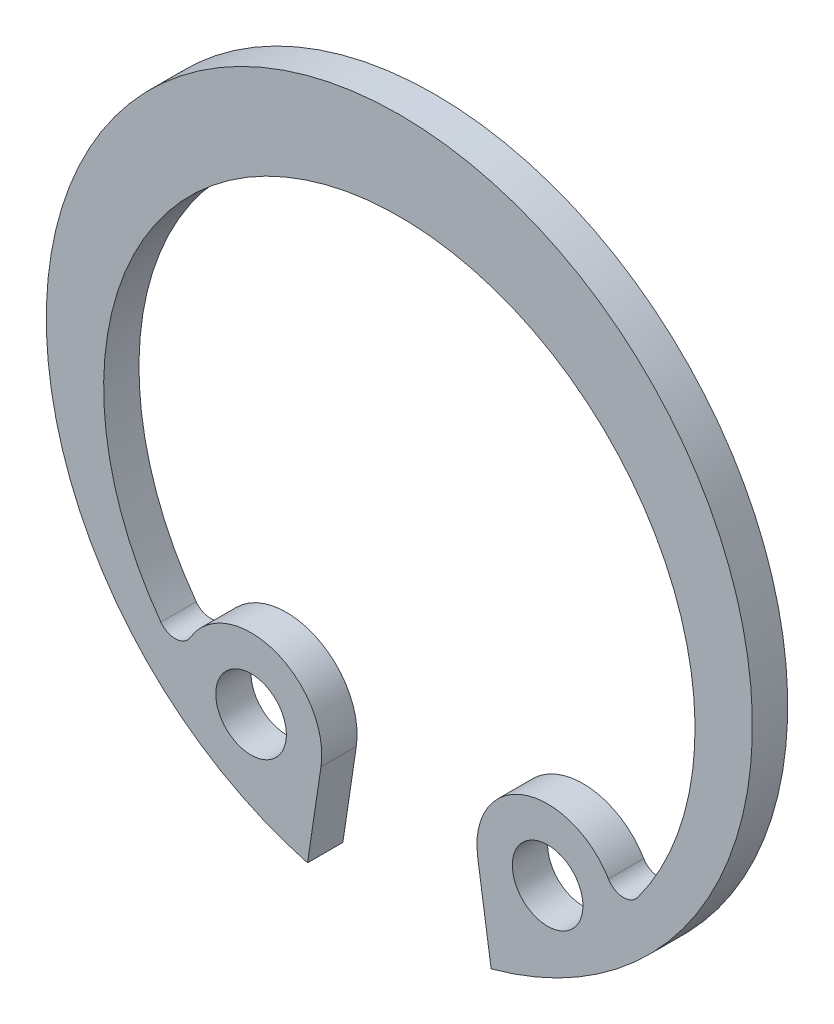
ISO-10303-21;
HEADER;
FILE_DESCRIPTION(('STEP AP214'),'2;1');
FILE_NAME('part.step','',(''),(''),'','','');
FILE_SCHEMA(('AUTOMOTIVE_DESIGN { 1 0 10303 214 1 1 1 1 }'));
ENDSEC;
DATA;
#1=APPLICATION_CONTEXT('core data for automotive mechanical design processes');
#2=APPLICATION_PROTOCOL_DEFINITION('international standard','automotive_design',2000,#1);
#3=PRODUCT_CONTEXT('',#1,'mechanical');
#4=PRODUCT('Part','Part','',(#3));
#5=PRODUCT_RELATED_PRODUCT_CATEGORY('part','',(#4));
#6=PRODUCT_DEFINITION_FORMATION('','',#4);
#7=PRODUCT_DEFINITION_CONTEXT('part definition',#1,'design');
#8=PRODUCT_DEFINITION('design','',#6,#7);
#9=PRODUCT_DEFINITION_SHAPE('','',#8);
#10=(LENGTH_UNIT() NAMED_UNIT(*) SI_UNIT(.MILLI.,.METRE.));
#11=(NAMED_UNIT(*) PLANE_ANGLE_UNIT() SI_UNIT($,.RADIAN.));
#12=(NAMED_UNIT(*) SI_UNIT($,.STERADIAN.) SOLID_ANGLE_UNIT());
#13=UNCERTAINTY_MEASURE_WITH_UNIT(LENGTH_MEASURE(1.E-05),#10,'distance_accuracy_value','');
#14=(GEOMETRIC_REPRESENTATION_CONTEXT(3) GLOBAL_UNCERTAINTY_ASSIGNED_CONTEXT((#13)) GLOBAL_UNIT_ASSIGNED_CONTEXT((#10,
#11,#12)) REPRESENTATION_CONTEXT('',''));
#15=CARTESIAN_POINT('',(0.,0.,0.));
#16=DIRECTION('',(0.,0.,1.));
#17=DIRECTION('',(1.,0.,0.));
#18=AXIS2_PLACEMENT_3D('',#15,#16,#17);
#19=CARTESIAN_POINT('',(-4.2,-6.81209963829693,1.));
#20=DIRECTION('',(0.,0.,1.));
#21=DIRECTION('',(1.,0.,0.));
#22=AXIS2_PLACEMENT_3D('',#19,#20,#21);
#23=PLANE('',#22);
#24=CARTESIAN_POINT('',(-4.2,-6.81209963829693,1.));
#25=DIRECTION('',(0.,0.,1.));
#26=DIRECTION('',(1.,0.,0.));
#27=AXIS2_PLACEMENT_3D('',#24,#25,#26);
#28=CIRCLE('',#27,1.);
#29=CARTESIAN_POINT('',(-3.2,-6.81209963829693,1.));
#30=VERTEX_POINT('',#29);
#31=EDGE_CURVE('E135',#30,#30,#28,.T.);
#32=ORIENTED_EDGE('',*,*,#31,.F.);
#33=EDGE_LOOP('',(#32));
#34=FACE_BOUND('',#33,.T.);
#35=CARTESIAN_POINT('',(-4.2,-6.81209963829693,1.));
#36=DIRECTION('',(0.,0.,1.));
#37=DIRECTION('',(1.,0.,0.));
#38=AXIS2_PLACEMENT_3D('',#35,#36,#37);
#39=CIRCLE('',#38,2.00279335495333);
#40=CARTESIAN_POINT('',(-2.21920560091532,-7.10813134470688,1.));
#41=VERTEX_POINT('',#40);
#42=CARTESIAN_POINT('',(-5.920924077702,-5.78759900802346,1.));
#43=VERTEX_POINT('',#42);
#44=EDGE_CURVE('E146',#41,#43,#39,.T.);
#45=ORIENTED_EDGE('',*,*,#44,.T.);
#46=CARTESIAN_POINT('',(-6.35055504123745,-5.53183107576533,1.));
#47=DIRECTION('',(0.,0.,-1.));
#48=DIRECTION('',(1.,0.,0.));
#49=AXIS2_PLACEMENT_3D('',#46,#47,#48);
#50=CIRCLE('',#49,0.499999999999999);
#51=CARTESIAN_POINT('',(-6.75376488512554,-5.82750289009963,1.));
#52=VERTEX_POINT('',#51);
#53=EDGE_CURVE('E94',#43,#52,#50,.T.);
#54=ORIENTED_EDGE('',*,*,#53,.T.);
#55=CARTESIAN_POINT('',(0.,-0.875000000000001,1.));
#56=DIRECTION('',(0.,0.,-1.));
#57=DIRECTION('',(1.,0.,0.));
#58=AXIS2_PLACEMENT_3D('',#55,#56,#57);
#59=CIRCLE('',#58,8.375);
#60=CARTESIAN_POINT('',(6.75376488512554,-5.82750289009963,1.));
#61=VERTEX_POINT('',#60);
#62=EDGE_CURVE('E161',#52,#61,#59,.T.);
#63=ORIENTED_EDGE('',*,*,#62,.T.);
#64=CARTESIAN_POINT('',(6.35055504123745,-5.53183107576533,1.));
#65=DIRECTION('',(0.,0.,-1.));
#66=DIRECTION('',(-1.,0.,0.));
#67=AXIS2_PLACEMENT_3D('',#64,#65,#66);
#68=CIRCLE('',#67,0.499999999999999);
#69=CARTESIAN_POINT('',(5.920924077702,-5.78759900802346,1.));
#70=VERTEX_POINT('',#69);
#71=EDGE_CURVE('E174',#61,#70,#68,.T.);
#72=ORIENTED_EDGE('',*,*,#71,.T.);
#73=CARTESIAN_POINT('',(4.2,-6.81209963829693,1.));
#74=DIRECTION('',(0.,0.,1.));
#75=DIRECTION('',(1.,0.,0.));
#76=AXIS2_PLACEMENT_3D('',#73,#74,#75);
#77=CIRCLE('',#76,2.00279335495333);
#78=CARTESIAN_POINT('',(2.21920560091532,-7.10813134470688,1.));
#79=VERTEX_POINT('',#78);
#80=EDGE_CURVE('E113',#70,#79,#77,.T.);
#81=ORIENTED_EDGE('',*,*,#80,.T.);
#82=DIRECTION('',(0.147809411129611,-0.989015863361917,0.));
#83=VECTOR('',#82,1.);
#84=CARTESIAN_POINT('',(2.21920560091532,-7.10813134470688,1.));
#85=LINE('',#84,#83);
#86=CARTESIAN_POINT('',(2.6,-9.65608616365865,1.));
#87=VERTEX_POINT('',#86);
#88=EDGE_CURVE('E107',#79,#87,#85,.T.);
#89=ORIENTED_EDGE('',*,*,#88,.T.);
#90=CARTESIAN_POINT('',(0.,0.,1.));
#91=DIRECTION('',(0.,0.,1.));
#92=DIRECTION('',(1.,0.,0.));
#93=AXIS2_PLACEMENT_3D('',#90,#91,#92);
#94=CIRCLE('',#93,10.);
#95=CARTESIAN_POINT('',(-2.6,-9.65608616365865,1.));
#96=VERTEX_POINT('',#95);
#97=EDGE_CURVE('E111',#87,#96,#94,.T.);
#98=ORIENTED_EDGE('',*,*,#97,.T.);
#99=DIRECTION('',(0.147809411129611,0.989015863361917,0.));
#100=VECTOR('',#99,1.);
#101=CARTESIAN_POINT('',(-2.21920560091532,-7.10813134470688,1.));
#102=LINE('',#101,#100);
#103=EDGE_CURVE('E51',#96,#41,#102,.T.);
#104=ORIENTED_EDGE('',*,*,#103,.T.);
#105=EDGE_LOOP('',(#45,#54,#63,#72,#81,#89,#98,#104));
#106=FACE_BOUND('',#105,.T.);
#107=CARTESIAN_POINT('',(4.2,-6.81209963829693,1.));
#108=DIRECTION('',(0.,0.,1.));
#109=DIRECTION('',(1.,0.,0.));
#110=AXIS2_PLACEMENT_3D('',#107,#108,#109);
#111=CIRCLE('',#110,1.);
#112=CARTESIAN_POINT('',(5.2,-6.81209963829693,1.));
#113=VERTEX_POINT('',#112);
#114=EDGE_CURVE('E183',#113,#113,#111,.T.);
#115=ORIENTED_EDGE('',*,*,#114,.F.);
#116=EDGE_LOOP('',(#115));
#117=FACE_BOUND('',#116,.T.);
#118=ADVANCED_FACE('F34',(#34,#106,#117),#23,.T.);
#119=CARTESIAN_POINT('',(-4.2,-6.81209963829693,0.));
#120=DIRECTION('',(0.,0.,1.));
#121=DIRECTION('',(1.,0.,0.));
#122=AXIS2_PLACEMENT_3D('',#119,#120,#121);
#123=PLANE('',#122);
#124=CARTESIAN_POINT('',(-4.2,-6.81209963829693,0.));
#125=DIRECTION('',(0.,0.,1.));
#126=DIRECTION('',(1.,0.,0.));
#127=AXIS2_PLACEMENT_3D('',#124,#125,#126);
#128=CIRCLE('',#127,1.);
#129=CARTESIAN_POINT('',(-3.2,-6.81209963829693,0.));
#130=VERTEX_POINT('',#129);
#131=EDGE_CURVE('E180',#130,#130,#128,.T.);
#132=ORIENTED_EDGE('',*,*,#131,.T.);
#133=EDGE_LOOP('',(#132));
#134=FACE_BOUND('',#133,.T.);
#135=CARTESIAN_POINT('',(-4.2,-6.81209963829693,0.));
#136=DIRECTION('',(0.,0.,1.));
#137=DIRECTION('',(1.,0.,0.));
#138=AXIS2_PLACEMENT_3D('',#135,#136,#137);
#139=CIRCLE('',#138,2.00279335495333);
#140=CARTESIAN_POINT('',(-2.21920560091532,-7.10813134470688,0.));
#141=VERTEX_POINT('',#140);
#142=CARTESIAN_POINT('',(-5.920924077702,-5.78759900802346,0.));
#143=VERTEX_POINT('',#142);
#144=EDGE_CURVE('E131',#141,#143,#139,.T.);
#145=ORIENTED_EDGE('',*,*,#144,.F.);
#146=DIRECTION('',(0.147809411129611,0.989015863361917,0.));
#147=VECTOR('',#146,1.);
#148=CARTESIAN_POINT('',(-2.21920560091532,-7.10813134470688,0.));
#149=LINE('',#148,#147);
#150=CARTESIAN_POINT('',(-2.6,-9.65608616365865,0.));
#151=VERTEX_POINT('',#150);
#152=EDGE_CURVE('E86',#151,#141,#149,.T.);
#153=ORIENTED_EDGE('',*,*,#152,.F.);
#154=CARTESIAN_POINT('',(0.,0.,0.));
#155=DIRECTION('',(0.,0.,1.));
#156=DIRECTION('',(1.,0.,0.));
#157=AXIS2_PLACEMENT_3D('',#154,#155,#156);
#158=CIRCLE('',#157,10.);
#159=CARTESIAN_POINT('',(2.6,-9.65608616365865,0.));
#160=VERTEX_POINT('',#159);
#161=EDGE_CURVE('E80',#160,#151,#158,.T.);
#162=ORIENTED_EDGE('',*,*,#161,.F.);
#163=DIRECTION('',(0.147809411129611,-0.989015863361917,0.));
#164=VECTOR('',#163,1.);
#165=CARTESIAN_POINT('',(2.21920560091532,-7.10813134470688,0.));
#166=LINE('',#165,#164);
#167=CARTESIAN_POINT('',(2.21920560091532,-7.10813134470688,0.));
#168=VERTEX_POINT('',#167);
#169=EDGE_CURVE('E121',#168,#160,#166,.T.);
#170=ORIENTED_EDGE('',*,*,#169,.F.);
#171=CARTESIAN_POINT('',(4.2,-6.81209963829693,0.));
#172=DIRECTION('',(0.,0.,1.));
#173=DIRECTION('',(1.,0.,0.));
#174=AXIS2_PLACEMENT_3D('',#171,#172,#173);
#175=CIRCLE('',#174,2.00279335495333);
#176=CARTESIAN_POINT('',(5.920924077702,-5.78759900802346,0.));
#177=VERTEX_POINT('',#176);
#178=EDGE_CURVE('E141',#177,#168,#175,.T.);
#179=ORIENTED_EDGE('',*,*,#178,.F.);
#180=CARTESIAN_POINT('',(6.35055504123745,-5.53183107576533,0.));
#181=DIRECTION('',(0.,0.,-1.));
#182=DIRECTION('',(-1.,0.,0.));
#183=AXIS2_PLACEMENT_3D('',#180,#181,#182);
#184=CIRCLE('',#183,0.499999999999999);
#185=CARTESIAN_POINT('',(6.75376488512554,-5.82750289009963,0.));
#186=VERTEX_POINT('',#185);
#187=EDGE_CURVE('E139',#186,#177,#184,.T.);
#188=ORIENTED_EDGE('',*,*,#187,.F.);
#189=CARTESIAN_POINT('',(0.,-0.875000000000001,0.));
#190=DIRECTION('',(0.,0.,-1.));
#191=DIRECTION('',(1.,0.,0.));
#192=AXIS2_PLACEMENT_3D('',#189,#190,#191);
#193=CIRCLE('',#192,8.375);
#194=CARTESIAN_POINT('',(-6.75376488512554,-5.82750289009963,0.));
#195=VERTEX_POINT('',#194);
#196=EDGE_CURVE('E137',#195,#186,#193,.T.);
#197=ORIENTED_EDGE('',*,*,#196,.F.);
#198=CARTESIAN_POINT('',(-6.35055504123745,-5.53183107576533,0.));
#199=DIRECTION('',(0.,0.,-1.));
#200=DIRECTION('',(1.,0.,0.));
#201=AXIS2_PLACEMENT_3D('',#198,#199,#200);
#202=CIRCLE('',#201,0.499999999999999);
#203=EDGE_CURVE('E134',#143,#195,#202,.T.);
#204=ORIENTED_EDGE('',*,*,#203,.F.);
#205=EDGE_LOOP('',(#145,#153,#162,#170,#179,#188,#197,#204));
#206=FACE_BOUND('',#205,.T.);
#207=CARTESIAN_POINT('',(4.2,-6.81209963829693,0.));
#208=DIRECTION('',(0.,0.,1.));
#209=DIRECTION('',(1.,0.,0.));
#210=AXIS2_PLACEMENT_3D('',#207,#208,#209);
#211=CIRCLE('',#210,1.);
#212=CARTESIAN_POINT('',(5.2,-6.81209963829693,0.));
#213=VERTEX_POINT('',#212);
#214=EDGE_CURVE('E186',#213,#213,#211,.T.);
#215=ORIENTED_EDGE('',*,*,#214,.T.);
#216=EDGE_LOOP('',(#215));
#217=FACE_BOUND('',#216,.T.);
#218=ADVANCED_FACE('F165',(#134,#206,#217),#123,.F.);
#219=CARTESIAN_POINT('',(-4.2,-6.81209963829693,1.));
#220=DIRECTION('',(0.,0.,-1.));
#221=DIRECTION('',(-1.,0.,0.));
#222=AXIS2_PLACEMENT_3D('',#219,#220,#221);
#223=CYLINDRICAL_SURFACE('',#222,2.00279335495333);
#224=ORIENTED_EDGE('',*,*,#144,.T.);
#225=DIRECTION('',(0.,0.,-1.));
#226=VECTOR('',#225,1.);
#227=CARTESIAN_POINT('',(-5.920924077702,-5.78759900802346,1.));
#228=LINE('',#227,#226);
#229=EDGE_CURVE('E11',#43,#143,#228,.T.);
#230=ORIENTED_EDGE('',*,*,#229,.F.);
#231=ORIENTED_EDGE('',*,*,#44,.F.);
#232=DIRECTION('',(0.,0.,-1.));
#233=VECTOR('',#232,1.);
#234=CARTESIAN_POINT('',(-2.21920560091532,-7.10813134470688,1.));
#235=LINE('',#234,#233);
#236=EDGE_CURVE('E127',#41,#141,#235,.T.);
#237=ORIENTED_EDGE('',*,*,#236,.T.);
#238=EDGE_LOOP('',(#224,#230,#231,#237));
#239=FACE_BOUND('',#238,.T.);
#240=ADVANCED_FACE('F36',(#239),#223,.T.);
#241=CARTESIAN_POINT('',(-6.35055504123745,-5.53183107576533,1.));
#242=DIRECTION('',(0.,0.,-1.));
#243=DIRECTION('',(-1.,0.,0.));
#244=AXIS2_PLACEMENT_3D('',#241,#242,#243);
#245=CYLINDRICAL_SURFACE('',#244,0.499999999999999);
#246=ORIENTED_EDGE('',*,*,#203,.T.);
#247=DIRECTION('',(0.,0.,-1.));
#248=VECTOR('',#247,1.);
#249=CARTESIAN_POINT('',(-6.75376488512554,-5.82750289009963,1.));
#250=LINE('',#249,#248);
#251=EDGE_CURVE('E43',#52,#195,#250,.T.);
#252=ORIENTED_EDGE('',*,*,#251,.F.);
#253=ORIENTED_EDGE('',*,*,#53,.F.);
#254=ORIENTED_EDGE('',*,*,#229,.T.);
#255=EDGE_LOOP('',(#246,#252,#253,#254));
#256=FACE_BOUND('',#255,.T.);
#257=ADVANCED_FACE('F219',(#256),#245,.F.);
#258=CARTESIAN_POINT('',(0.,-0.875000000000001,1.));
#259=DIRECTION('',(0.,0.,-1.));
#260=DIRECTION('',(-1.,0.,0.));
#261=AXIS2_PLACEMENT_3D('',#258,#259,#260);
#262=CYLINDRICAL_SURFACE('',#261,8.375);
#263=ORIENTED_EDGE('',*,*,#196,.T.);
#264=DIRECTION('',(0.,0.,-1.));
#265=VECTOR('',#264,1.);
#266=CARTESIAN_POINT('',(6.75376488512554,-5.82750289009963,1.));
#267=LINE('',#266,#265);
#268=EDGE_CURVE('E153',#61,#186,#267,.T.);
#269=ORIENTED_EDGE('',*,*,#268,.F.);
#270=ORIENTED_EDGE('',*,*,#62,.F.);
#271=ORIENTED_EDGE('',*,*,#251,.T.);
#272=EDGE_LOOP('',(#263,#269,#270,#271));
#273=FACE_BOUND('',#272,.T.);
#274=ADVANCED_FACE('F159',(#273),#262,.F.);
#275=CARTESIAN_POINT('',(6.35055504123745,-5.53183107576533,1.));
#276=DIRECTION('',(0.,0.,-1.));
#277=DIRECTION('',(-1.,0.,0.));
#278=AXIS2_PLACEMENT_3D('',#275,#276,#277);
#279=CYLINDRICAL_SURFACE('',#278,0.499999999999999);
#280=ORIENTED_EDGE('',*,*,#187,.T.);
#281=DIRECTION('',(0.,0.,-1.));
#282=VECTOR('',#281,1.);
#283=CARTESIAN_POINT('',(5.920924077702,-5.78759900802346,1.));
#284=LINE('',#283,#282);
#285=EDGE_CURVE('E150',#70,#177,#284,.T.);
#286=ORIENTED_EDGE('',*,*,#285,.F.);
#287=ORIENTED_EDGE('',*,*,#71,.F.);
#288=ORIENTED_EDGE('',*,*,#268,.T.);
#289=EDGE_LOOP('',(#280,#286,#287,#288));
#290=FACE_BOUND('',#289,.T.);
#291=ADVANCED_FACE('F170',(#290),#279,.F.);
#292=CARTESIAN_POINT('',(4.2,-6.81209963829693,1.));
#293=DIRECTION('',(0.,0.,-1.));
#294=DIRECTION('',(-1.,0.,0.));
#295=AXIS2_PLACEMENT_3D('',#292,#293,#294);
#296=CYLINDRICAL_SURFACE('',#295,2.00279335495333);
#297=ORIENTED_EDGE('',*,*,#178,.T.);
#298=DIRECTION('',(0.,0.,-1.));
#299=VECTOR('',#298,1.);
#300=CARTESIAN_POINT('',(2.21920560091532,-7.10813134470688,1.));
#301=LINE('',#300,#299);
#302=EDGE_CURVE('E122',#79,#168,#301,.T.);
#303=ORIENTED_EDGE('',*,*,#302,.F.);
#304=ORIENTED_EDGE('',*,*,#80,.F.);
#305=ORIENTED_EDGE('',*,*,#285,.T.);
#306=EDGE_LOOP('',(#297,#303,#304,#305));
#307=FACE_BOUND('',#306,.T.);
#308=ADVANCED_FACE('F173',(#307),#296,.T.);
#309=CARTESIAN_POINT('',(2.21920560091532,-7.10813134470688,1.));
#310=DIRECTION('',(0.989015863361917,0.147809411129611,0.));
#311=DIRECTION('',(-0.147809411129611,0.989015863361917,0.));
#312=AXIS2_PLACEMENT_3D('',#309,#310,#311);
#313=PLANE('',#312);
#314=ORIENTED_EDGE('',*,*,#169,.T.);
#315=DIRECTION('',(0.,0.,-1.));
#316=VECTOR('',#315,1.);
#317=CARTESIAN_POINT('',(2.6,-9.65608616365865,1.));
#318=LINE('',#317,#316);
#319=EDGE_CURVE('E118',#87,#160,#318,.T.);
#320=ORIENTED_EDGE('',*,*,#319,.F.);
#321=ORIENTED_EDGE('',*,*,#88,.F.);
#322=ORIENTED_EDGE('',*,*,#302,.T.);
#323=EDGE_LOOP('',(#314,#320,#321,#322));
#324=FACE_BOUND('',#323,.T.);
#325=ADVANCED_FACE('F119',(#324),#313,.F.);
#326=CARTESIAN_POINT('',(0.,0.,1.));
#327=DIRECTION('',(0.,0.,-1.));
#328=DIRECTION('',(-1.,0.,0.));
#329=AXIS2_PLACEMENT_3D('',#326,#327,#328);
#330=CYLINDRICAL_SURFACE('',#329,10.);
#331=ORIENTED_EDGE('',*,*,#161,.T.);
#332=DIRECTION('',(0.,0.,-1.));
#333=VECTOR('',#332,1.);
#334=CARTESIAN_POINT('',(-2.6,-9.65608616365865,1.));
#335=LINE('',#334,#333);
#336=EDGE_CURVE('E123',#96,#151,#335,.T.);
#337=ORIENTED_EDGE('',*,*,#336,.F.);
#338=ORIENTED_EDGE('',*,*,#97,.F.);
#339=ORIENTED_EDGE('',*,*,#319,.T.);
#340=EDGE_LOOP('',(#331,#337,#338,#339));
#341=FACE_BOUND('',#340,.T.);
#342=ADVANCED_FACE('F125',(#341),#330,.T.);
#343=CARTESIAN_POINT('',(-2.21920560091532,-7.10813134470688,1.));
#344=DIRECTION('',(-0.989015863361917,0.147809411129611,0.));
#345=DIRECTION('',(-0.147809411129611,-0.989015863361917,0.));
#346=AXIS2_PLACEMENT_3D('',#343,#344,#345);
#347=PLANE('',#346);
#348=ORIENTED_EDGE('',*,*,#152,.T.);
#349=ORIENTED_EDGE('',*,*,#236,.F.);
#350=ORIENTED_EDGE('',*,*,#103,.F.);
#351=ORIENTED_EDGE('',*,*,#336,.T.);
#352=EDGE_LOOP('',(#348,#349,#350,#351));
#353=FACE_BOUND('',#352,.T.);
#354=ADVANCED_FACE('F207',(#353),#347,.F.);
#355=CARTESIAN_POINT('',(-4.2,-6.81209963829693,1.));
#356=DIRECTION('',(0.,0.,-1.));
#357=DIRECTION('',(-1.,0.,0.));
#358=AXIS2_PLACEMENT_3D('',#355,#356,#357);
#359=CYLINDRICAL_SURFACE('',#358,1.);
#360=ORIENTED_EDGE('',*,*,#31,.T.);
#361=EDGE_LOOP('',(#360));
#362=FACE_BOUND('',#361,.T.);
#363=ORIENTED_EDGE('',*,*,#131,.F.);
#364=EDGE_LOOP('',(#363));
#365=FACE_BOUND('',#364,.T.);
#366=ADVANCED_FACE('F204',(#362,#365),#359,.F.);
#367=CARTESIAN_POINT('',(4.2,-6.81209963829693,1.));
#368=DIRECTION('',(0.,0.,-1.));
#369=DIRECTION('',(-1.,0.,0.));
#370=AXIS2_PLACEMENT_3D('',#367,#368,#369);
#371=CYLINDRICAL_SURFACE('',#370,1.);
#372=ORIENTED_EDGE('',*,*,#114,.T.);
#373=EDGE_LOOP('',(#372));
#374=FACE_BOUND('',#373,.T.);
#375=ORIENTED_EDGE('',*,*,#214,.F.);
#376=EDGE_LOOP('',(#375));
#377=FACE_BOUND('',#376,.T.);
#378=ADVANCED_FACE('F192',(#374,#377),#371,.F.);
#379=CLOSED_SHELL('',(#118,#218,#240,#257,#274,#291,#308,#325,#342,#354,#366,#378));
#380=MANIFOLD_SOLID_BREP('B2',#379);
#381=ADVANCED_BREP_SHAPE_REPRESENTATION('',(#18,#380),#14);
#382=SHAPE_DEFINITION_REPRESENTATION(#9,#381);
ENDSEC;
END-ISO-10303-21;
